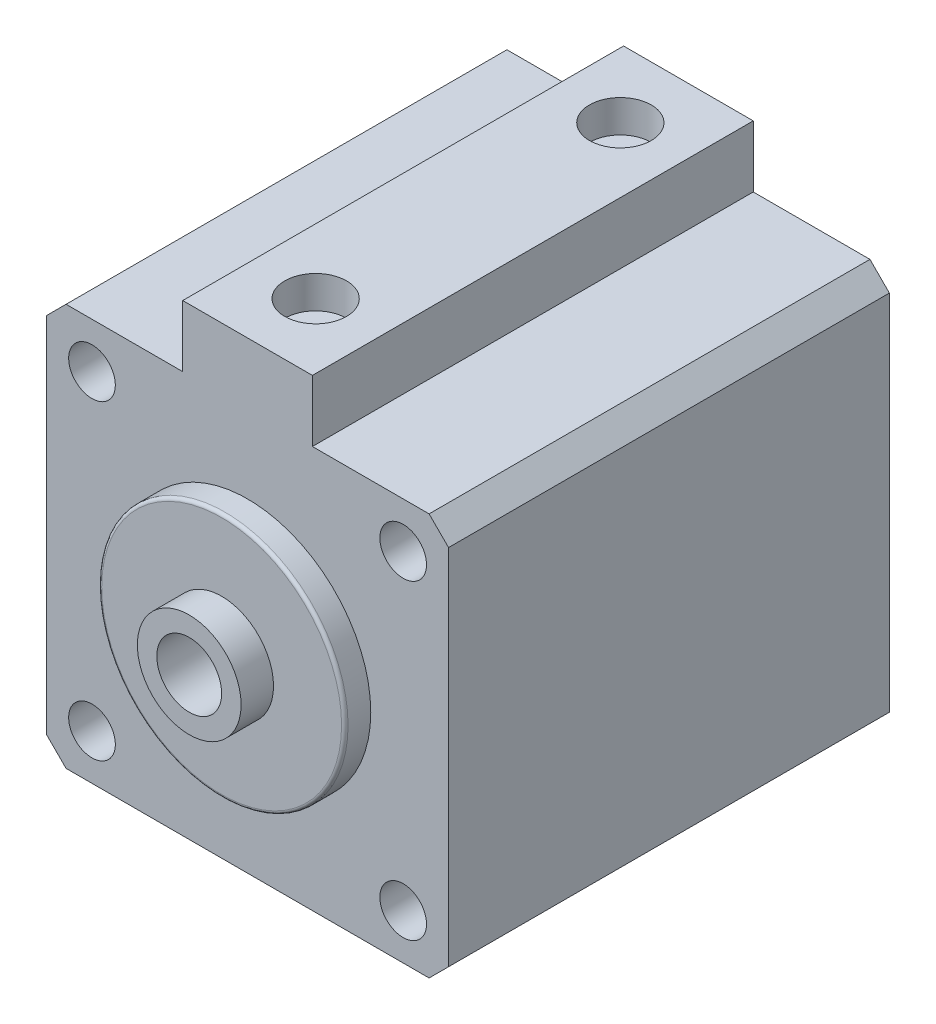
ISO-10303-21;
HEADER;
FILE_DESCRIPTION(('STEP AP214'),'2;1');
FILE_NAME('part.step','',(''),(''),'','','');
FILE_SCHEMA(('AUTOMOTIVE_DESIGN { 1 0 10303 214 1 1 1 1 }'));
ENDSEC;
DATA;
#1=APPLICATION_CONTEXT('core data for automotive mechanical design processes');
#2=APPLICATION_PROTOCOL_DEFINITION('international standard','automotive_design',2000,#1);
#3=PRODUCT_CONTEXT('',#1,'mechanical');
#4=PRODUCT('Part','Part','',(#3));
#5=PRODUCT_RELATED_PRODUCT_CATEGORY('part','',(#4));
#6=PRODUCT_DEFINITION_FORMATION('','',#4);
#7=PRODUCT_DEFINITION_CONTEXT('part definition',#1,'design');
#8=PRODUCT_DEFINITION('design','',#6,#7);
#9=PRODUCT_DEFINITION_SHAPE('','',#8);
#10=(LENGTH_UNIT() NAMED_UNIT(*) SI_UNIT(.MILLI.,.METRE.));
#11=(NAMED_UNIT(*) PLANE_ANGLE_UNIT() SI_UNIT($,.RADIAN.));
#12=(NAMED_UNIT(*) SI_UNIT($,.STERADIAN.) SOLID_ANGLE_UNIT());
#13=UNCERTAINTY_MEASURE_WITH_UNIT(LENGTH_MEASURE(1.E-05),#10,'distance_accuracy_value','');
#14=(GEOMETRIC_REPRESENTATION_CONTEXT(3) GLOBAL_UNCERTAINTY_ASSIGNED_CONTEXT((#13)) GLOBAL_UNIT_ASSIGNED_CONTEXT((#10,
#11,#12)) REPRESENTATION_CONTEXT('',''));
#15=CARTESIAN_POINT('',(0.,0.,0.));
#16=DIRECTION('',(0.,0.,1.));
#17=DIRECTION('',(1.,0.,0.));
#18=AXIS2_PLACEMENT_3D('',#15,#16,#17);
#19=CARTESIAN_POINT('',(0.,62.,68.));
#20=DIRECTION('',(0.,-1.,0.));
#21=DIRECTION('',(0.,0.,-1.));
#22=AXIS2_PLACEMENT_3D('',#19,#20,#21);
#23=PLANE('',#22);
#24=DIRECTION('',(0.,0.,1.));
#25=VECTOR('',#24,1.);
#26=CARTESIAN_POINT('',(21.,62.,0.));
#27=LINE('',#26,#25);
#28=CARTESIAN_POINT('',(21.,62.,0.));
#29=VERTEX_POINT('',#28);
#30=CARTESIAN_POINT('',(21.,62.,68.));
#31=VERTEX_POINT('',#30);
#32=EDGE_CURVE('E127',#29,#31,#27,.T.);
#33=ORIENTED_EDGE('',*,*,#32,.F.);
#34=DIRECTION('',(-1.,0.,0.));
#35=VECTOR('',#34,1.);
#36=CARTESIAN_POINT('',(0.,62.,0.));
#37=LINE('',#36,#35);
#38=CARTESIAN_POINT('',(3.00000000000002,62.,0.));
#39=VERTEX_POINT('',#38);
#40=EDGE_CURVE('E140',#29,#39,#37,.T.);
#41=ORIENTED_EDGE('',*,*,#40,.T.);
#42=DIRECTION('',(0.,0.,1.));
#43=VECTOR('',#42,1.);
#44=CARTESIAN_POINT('',(3.00000000000002,62.,68.));
#45=LINE('',#44,#43);
#46=CARTESIAN_POINT('',(3.00000000000002,62.,68.));
#47=VERTEX_POINT('',#46);
#48=EDGE_CURVE('E164',#39,#47,#45,.T.);
#49=ORIENTED_EDGE('',*,*,#48,.T.);
#50=DIRECTION('',(-1.,0.,0.));
#51=VECTOR('',#50,1.);
#52=CARTESIAN_POINT('',(0.,62.,68.));
#53=LINE('',#52,#51);
#54=EDGE_CURVE('E142',#31,#47,#53,.T.);
#55=ORIENTED_EDGE('',*,*,#54,.F.);
#56=EDGE_LOOP('',(#33,#41,#49,#55));
#57=FACE_BOUND('',#56,.T.);
#58=ADVANCED_FACE('F33',(#57),#23,.F.);
#59=CARTESIAN_POINT('',(0.,0.,68.));
#60=DIRECTION('',(1.,0.,0.));
#61=DIRECTION('',(0.,0.,-1.));
#62=AXIS2_PLACEMENT_3D('',#59,#60,#61);
#63=PLANE('',#62);
#64=DIRECTION('',(0.,-1.,0.));
#65=VECTOR('',#64,1.);
#66=CARTESIAN_POINT('',(0.,0.,0.));
#67=LINE('',#66,#65);
#68=CARTESIAN_POINT('',(0.,59.,0.));
#69=VERTEX_POINT('',#68);
#70=CARTESIAN_POINT('',(0.,3.00000000000002,0.));
#71=VERTEX_POINT('',#70);
#72=EDGE_CURVE('E285',#69,#71,#67,.T.);
#73=ORIENTED_EDGE('',*,*,#72,.T.);
#74=DIRECTION('',(0.,0.,1.));
#75=VECTOR('',#74,1.);
#76=CARTESIAN_POINT('',(0.,3.00000000000002,68.));
#77=LINE('',#76,#75);
#78=CARTESIAN_POINT('',(0.,3.00000000000002,68.));
#79=VERTEX_POINT('',#78);
#80=EDGE_CURVE('E197',#71,#79,#77,.T.);
#81=ORIENTED_EDGE('',*,*,#80,.T.);
#82=DIRECTION('',(0.,-1.,0.));
#83=VECTOR('',#82,1.);
#84=CARTESIAN_POINT('',(0.,0.,68.));
#85=LINE('',#84,#83);
#86=CARTESIAN_POINT('',(0.,59.,68.));
#87=VERTEX_POINT('',#86);
#88=EDGE_CURVE('E155',#87,#79,#85,.T.);
#89=ORIENTED_EDGE('',*,*,#88,.F.);
#90=DIRECTION('',(0.,0.,-1.));
#91=VECTOR('',#90,1.);
#92=CARTESIAN_POINT('',(0.,59.,68.));
#93=LINE('',#92,#91);
#94=EDGE_CURVE('E194',#87,#69,#93,.T.);
#95=ORIENTED_EDGE('',*,*,#94,.T.);
#96=EDGE_LOOP('',(#73,#81,#89,#95));
#97=FACE_BOUND('',#96,.T.);
#98=ADVANCED_FACE('F215',(#97),#63,.F.);
#99=CARTESIAN_POINT('',(0.,0.,68.));
#100=DIRECTION('',(0.,1.,0.));
#101=DIRECTION('',(0.,0.,1.));
#102=AXIS2_PLACEMENT_3D('',#99,#100,#101);
#103=PLANE('',#102);
#104=DIRECTION('',(1.,0.,0.));
#105=VECTOR('',#104,1.);
#106=CARTESIAN_POINT('',(0.,0.,0.));
#107=LINE('',#106,#105);
#108=CARTESIAN_POINT('',(3.,0.,0.));
#109=VERTEX_POINT('',#108);
#110=CARTESIAN_POINT('',(59.,0.,0.));
#111=VERTEX_POINT('',#110);
#112=EDGE_CURVE('E157',#109,#111,#107,.T.);
#113=ORIENTED_EDGE('',*,*,#112,.T.);
#114=DIRECTION('',(0.,0.,1.));
#115=VECTOR('',#114,1.);
#116=CARTESIAN_POINT('',(59.,0.,68.));
#117=LINE('',#116,#115);
#118=CARTESIAN_POINT('',(59.,0.,68.));
#119=VERTEX_POINT('',#118);
#120=EDGE_CURVE('E56',#111,#119,#117,.T.);
#121=ORIENTED_EDGE('',*,*,#120,.T.);
#122=DIRECTION('',(1.,0.,0.));
#123=VECTOR('',#122,1.);
#124=CARTESIAN_POINT('',(0.,0.,68.));
#125=LINE('',#124,#123);
#126=CARTESIAN_POINT('',(3.,0.,68.));
#127=VERTEX_POINT('',#126);
#128=EDGE_CURVE('E290',#127,#119,#125,.T.);
#129=ORIENTED_EDGE('',*,*,#128,.F.);
#130=DIRECTION('',(0.,0.,-1.));
#131=VECTOR('',#130,1.);
#132=CARTESIAN_POINT('',(3.,0.,68.));
#133=LINE('',#132,#131);
#134=EDGE_CURVE('E190',#127,#109,#133,.T.);
#135=ORIENTED_EDGE('',*,*,#134,.T.);
#136=EDGE_LOOP('',(#113,#121,#129,#135));
#137=FACE_BOUND('',#136,.T.);
#138=ADVANCED_FACE('F221',(#137),#103,.F.);
#139=CARTESIAN_POINT('',(62.,0.,68.));
#140=DIRECTION('',(-1.,0.,0.));
#141=DIRECTION('',(0.,0.,1.));
#142=AXIS2_PLACEMENT_3D('',#139,#140,#141);
#143=PLANE('',#142);
#144=DIRECTION('',(0.,1.,0.));
#145=VECTOR('',#144,1.);
#146=CARTESIAN_POINT('',(62.,0.,0.));
#147=LINE('',#146,#145);
#148=CARTESIAN_POINT('',(62.,3.,0.));
#149=VERTEX_POINT('',#148);
#150=CARTESIAN_POINT('',(62.,59.,0.));
#151=VERTEX_POINT('',#150);
#152=EDGE_CURVE('E152',#149,#151,#147,.T.);
#153=ORIENTED_EDGE('',*,*,#152,.T.);
#154=DIRECTION('',(0.,0.,1.));
#155=VECTOR('',#154,1.);
#156=CARTESIAN_POINT('',(62.,59.,68.));
#157=LINE('',#156,#155);
#158=CARTESIAN_POINT('',(62.,59.,68.));
#159=VERTEX_POINT('',#158);
#160=EDGE_CURVE('E180',#151,#159,#157,.T.);
#161=ORIENTED_EDGE('',*,*,#160,.T.);
#162=DIRECTION('',(0.,1.,0.));
#163=VECTOR('',#162,1.);
#164=CARTESIAN_POINT('',(62.,0.,68.));
#165=LINE('',#164,#163);
#166=CARTESIAN_POINT('',(62.,3.,68.));
#167=VERTEX_POINT('',#166);
#168=EDGE_CURVE('E292',#167,#159,#165,.T.);
#169=ORIENTED_EDGE('',*,*,#168,.F.);
#170=DIRECTION('',(0.,0.,-1.));
#171=VECTOR('',#170,1.);
#172=CARTESIAN_POINT('',(62.,3.,68.));
#173=LINE('',#172,#171);
#174=EDGE_CURVE('E177',#167,#149,#173,.T.);
#175=ORIENTED_EDGE('',*,*,#174,.T.);
#176=EDGE_LOOP('',(#153,#161,#169,#175));
#177=FACE_BOUND('',#176,.T.);
#178=ADVANCED_FACE('F228',(#177),#143,.F.);
#179=CARTESIAN_POINT('',(59.,62.,0.));
#180=VERTEX_POINT('',#179);
#181=CARTESIAN_POINT('',(41.,62.,0.));
#182=VERTEX_POINT('',#181);
#183=EDGE_CURVE('E151',#180,#182,#37,.T.);
#184=ORIENTED_EDGE('',*,*,#183,.T.);
#185=DIRECTION('',(0.,0.,1.));
#186=VECTOR('',#185,1.);
#187=CARTESIAN_POINT('',(41.,62.,0.));
#188=LINE('',#187,#186);
#189=CARTESIAN_POINT('',(41.,62.,68.));
#190=VERTEX_POINT('',#189);
#191=EDGE_CURVE('E143',#182,#190,#188,.T.);
#192=ORIENTED_EDGE('',*,*,#191,.T.);
#193=CARTESIAN_POINT('',(59.,62.,68.));
#194=VERTEX_POINT('',#193);
#195=EDGE_CURVE('E165',#194,#190,#53,.T.);
#196=ORIENTED_EDGE('',*,*,#195,.F.);
#197=DIRECTION('',(0.,0.,-1.));
#198=VECTOR('',#197,1.);
#199=CARTESIAN_POINT('',(59.,62.,68.));
#200=LINE('',#199,#198);
#201=EDGE_CURVE('E167',#194,#180,#200,.T.);
#202=ORIENTED_EDGE('',*,*,#201,.T.);
#203=EDGE_LOOP('',(#184,#192,#196,#202));
#204=FACE_BOUND('',#203,.T.);
#205=ADVANCED_FACE('F217',(#204),#23,.F.);
#206=CARTESIAN_POINT('',(0.,0.,68.));
#207=DIRECTION('',(0.,0.,-1.));
#208=DIRECTION('',(-1.,0.,0.));
#209=AXIS2_PLACEMENT_3D('',#206,#207,#208);
#210=PLANE('',#209);
#211=CARTESIAN_POINT('',(55.,55.,68.));
#212=DIRECTION('',(0.,0.,-1.));
#213=DIRECTION('',(-1.,0.,0.));
#214=AXIS2_PLACEMENT_3D('',#211,#212,#213);
#215=CIRCLE('',#214,3.6);
#216=CARTESIAN_POINT('',(51.4,55.,68.));
#217=VERTEX_POINT('',#216);
#218=EDGE_CURVE('E272',#217,#217,#215,.T.);
#219=ORIENTED_EDGE('',*,*,#218,.T.);
#220=EDGE_LOOP('',(#219));
#221=FACE_BOUND('',#220,.T.);
#222=CARTESIAN_POINT('',(55.,7.00000000000001,68.));
#223=DIRECTION('',(0.,0.,-1.));
#224=DIRECTION('',(-1.,0.,0.));
#225=AXIS2_PLACEMENT_3D('',#222,#223,#224);
#226=CIRCLE('',#225,3.6);
#227=CARTESIAN_POINT('',(51.4,7.00000000000001,68.));
#228=VERTEX_POINT('',#227);
#229=EDGE_CURVE('E269',#228,#228,#226,.T.);
#230=ORIENTED_EDGE('',*,*,#229,.T.);
#231=EDGE_LOOP('',(#230));
#232=FACE_BOUND('',#231,.T.);
#233=CARTESIAN_POINT('',(7.00000000000001,6.99999999999999,68.));
#234=DIRECTION('',(0.,0.,-1.));
#235=DIRECTION('',(-1.,0.,0.));
#236=AXIS2_PLACEMENT_3D('',#233,#234,#235);
#237=CIRCLE('',#236,3.6);
#238=CARTESIAN_POINT('',(3.40000000000002,6.99999999999999,68.));
#239=VERTEX_POINT('',#238);
#240=EDGE_CURVE('E261',#239,#239,#237,.T.);
#241=ORIENTED_EDGE('',*,*,#240,.T.);
#242=EDGE_LOOP('',(#241));
#243=FACE_BOUND('',#242,.T.);
#244=CARTESIAN_POINT('',(7.,55.,68.));
#245=DIRECTION('',(0.,0.,-1.));
#246=DIRECTION('',(-1.,0.,0.));
#247=AXIS2_PLACEMENT_3D('',#244,#245,#246);
#248=CIRCLE('',#247,3.6);
#249=CARTESIAN_POINT('',(3.4,55.,68.));
#250=VERTEX_POINT('',#249);
#251=EDGE_CURVE('E278',#250,#250,#248,.T.);
#252=ORIENTED_EDGE('',*,*,#251,.T.);
#253=EDGE_LOOP('',(#252));
#254=FACE_BOUND('',#253,.T.);
#255=CARTESIAN_POINT('',(31.,31.,68.));
#256=DIRECTION('',(0.,0.,-1.));
#257=DIRECTION('',(-1.,0.,0.));
#258=AXIS2_PLACEMENT_3D('',#255,#256,#257);
#259=CIRCLE('',#258,19.);
#260=CARTESIAN_POINT('',(12.,31.,68.));
#261=VERTEX_POINT('',#260);
#262=EDGE_CURVE('E161',#261,#261,#259,.F.);
#263=ORIENTED_EDGE('',*,*,#262,.F.);
#264=EDGE_LOOP('',(#263));
#265=FACE_BOUND('',#264,.T.);
#266=ORIENTED_EDGE('',*,*,#168,.T.);
#267=DIRECTION('',(0.707106781186546,-0.707106781186549,0.));
#268=VECTOR('',#267,1.);
#269=CARTESIAN_POINT('',(59.,62.,68.));
#270=LINE('',#269,#268);
#271=EDGE_CURVE('E188',#159,#194,#270,.F.);
#272=ORIENTED_EDGE('',*,*,#271,.T.);
#273=ORIENTED_EDGE('',*,*,#195,.T.);
#274=DIRECTION('',(0.,1.,0.));
#275=VECTOR('',#274,1.);
#276=CARTESIAN_POINT('',(41.,62.,68.));
#277=LINE('',#276,#275);
#278=CARTESIAN_POINT('',(41.,71.5,68.));
#279=VERTEX_POINT('',#278);
#280=EDGE_CURVE('E48',#190,#279,#277,.T.);
#281=ORIENTED_EDGE('',*,*,#280,.T.);
#282=DIRECTION('',(-1.,0.,0.));
#283=VECTOR('',#282,1.);
#284=CARTESIAN_POINT('',(21.,71.5,68.));
#285=LINE('',#284,#283);
#286=CARTESIAN_POINT('',(21.,71.5,68.));
#287=VERTEX_POINT('',#286);
#288=EDGE_CURVE('E135',#279,#287,#285,.T.);
#289=ORIENTED_EDGE('',*,*,#288,.T.);
#290=DIRECTION('',(0.,-1.,0.));
#291=VECTOR('',#290,1.);
#292=CARTESIAN_POINT('',(21.,62.,68.));
#293=LINE('',#292,#291);
#294=EDGE_CURVE('E247',#287,#31,#293,.T.);
#295=ORIENTED_EDGE('',*,*,#294,.T.);
#296=ORIENTED_EDGE('',*,*,#54,.T.);
#297=DIRECTION('',(0.707106781186549,0.707106781186546,0.));
#298=VECTOR('',#297,1.);
#299=CARTESIAN_POINT('',(0.,59.,68.));
#300=LINE('',#299,#298);
#301=EDGE_CURVE('E182',#47,#87,#300,.F.);
#302=ORIENTED_EDGE('',*,*,#301,.T.);
#303=ORIENTED_EDGE('',*,*,#88,.T.);
#304=DIRECTION('',(-0.707106781186546,0.707106781186549,0.));
#305=VECTOR('',#304,1.);
#306=CARTESIAN_POINT('',(3.,0.,68.));
#307=LINE('',#306,#305);
#308=EDGE_CURVE('E184',#79,#127,#307,.F.);
#309=ORIENTED_EDGE('',*,*,#308,.T.);
#310=ORIENTED_EDGE('',*,*,#128,.T.);
#311=DIRECTION('',(-0.707106781186549,-0.707106781186546,0.));
#312=VECTOR('',#311,1.);
#313=CARTESIAN_POINT('',(62.,3.,68.));
#314=LINE('',#313,#312);
#315=EDGE_CURVE('E186',#119,#167,#314,.F.);
#316=ORIENTED_EDGE('',*,*,#315,.T.);
#317=EDGE_LOOP('',(#266,#272,#273,#281,#289,#295,#296,#302,#303,#309,#310,#316));
#318=FACE_BOUND('',#317,.T.);
#319=ADVANCED_FACE('F227',(#221,#232,#243,#254,#265,#318),#210,.F.);
#320=CARTESIAN_POINT('',(0.,0.,0.));
#321=DIRECTION('',(0.,0.,-1.));
#322=DIRECTION('',(-1.,0.,0.));
#323=AXIS2_PLACEMENT_3D('',#320,#321,#322);
#324=PLANE('',#323);
#325=CARTESIAN_POINT('',(55.,55.,0.));
#326=DIRECTION('',(0.,0.,1.));
#327=DIRECTION('',(-1.,0.,0.));
#328=AXIS2_PLACEMENT_3D('',#325,#326,#327);
#329=CIRCLE('',#328,3.6);
#330=CARTESIAN_POINT('',(51.4,55.,0.));
#331=VERTEX_POINT('',#330);
#332=EDGE_CURVE('E258',#331,#331,#329,.T.);
#333=ORIENTED_EDGE('',*,*,#332,.T.);
#334=EDGE_LOOP('',(#333));
#335=FACE_BOUND('',#334,.T.);
#336=CARTESIAN_POINT('',(55.,7.00000000000001,0.));
#337=DIRECTION('',(0.,0.,1.));
#338=DIRECTION('',(1.,0.,0.));
#339=AXIS2_PLACEMENT_3D('',#336,#337,#338);
#340=CIRCLE('',#339,3.6);
#341=CARTESIAN_POINT('',(58.6,7.00000000000001,0.));
#342=VERTEX_POINT('',#341);
#343=EDGE_CURVE('E262',#342,#342,#340,.T.);
#344=ORIENTED_EDGE('',*,*,#343,.T.);
#345=EDGE_LOOP('',(#344));
#346=FACE_BOUND('',#345,.T.);
#347=CARTESIAN_POINT('',(7.00000000000001,6.99999999999999,0.));
#348=DIRECTION('',(0.,0.,1.));
#349=DIRECTION('',(-1.,0.,0.));
#350=AXIS2_PLACEMENT_3D('',#347,#348,#349);
#351=CIRCLE('',#350,3.6);
#352=CARTESIAN_POINT('',(3.40000000000002,6.99999999999999,0.));
#353=VERTEX_POINT('',#352);
#354=EDGE_CURVE('E254',#353,#353,#351,.T.);
#355=ORIENTED_EDGE('',*,*,#354,.T.);
#356=EDGE_LOOP('',(#355));
#357=FACE_BOUND('',#356,.T.);
#358=CARTESIAN_POINT('',(7.,55.,0.));
#359=DIRECTION('',(0.,0.,1.));
#360=DIRECTION('',(1.,0.,0.));
#361=AXIS2_PLACEMENT_3D('',#358,#359,#360);
#362=CIRCLE('',#361,3.6);
#363=CARTESIAN_POINT('',(10.6,55.,0.));
#364=VERTEX_POINT('',#363);
#365=EDGE_CURVE('E275',#364,#364,#362,.T.);
#366=ORIENTED_EDGE('',*,*,#365,.T.);
#367=EDGE_LOOP('',(#366));
#368=FACE_BOUND('',#367,.T.);
#369=ORIENTED_EDGE('',*,*,#183,.F.);
#370=DIRECTION('',(-0.707106781186546,0.707106781186549,0.));
#371=VECTOR('',#370,1.);
#372=CARTESIAN_POINT('',(60.5000000000001,60.4999999999999,0.));
#373=LINE('',#372,#371);
#374=EDGE_CURVE('E175',#180,#151,#373,.F.);
#375=ORIENTED_EDGE('',*,*,#374,.T.);
#376=ORIENTED_EDGE('',*,*,#152,.F.);
#377=DIRECTION('',(0.707106781186549,0.707106781186546,0.));
#378=VECTOR('',#377,1.);
#379=CARTESIAN_POINT('',(29.4999999999999,-29.5,0.));
#380=LINE('',#379,#378);
#381=EDGE_CURVE('E173',#149,#111,#380,.F.);
#382=ORIENTED_EDGE('',*,*,#381,.T.);
#383=ORIENTED_EDGE('',*,*,#112,.F.);
#384=DIRECTION('',(0.707106781186546,-0.707106781186549,0.));
#385=VECTOR('',#384,1.);
#386=CARTESIAN_POINT('',(1.50000000000001,1.5,0.));
#387=LINE('',#386,#385);
#388=EDGE_CURVE('E171',#109,#71,#387,.F.);
#389=ORIENTED_EDGE('',*,*,#388,.T.);
#390=ORIENTED_EDGE('',*,*,#72,.F.);
#391=DIRECTION('',(-0.707106781186549,-0.707106781186546,0.));
#392=VECTOR('',#391,1.);
#393=CARTESIAN_POINT('',(-29.5,29.5000000000001,0.));
#394=LINE('',#393,#392);
#395=EDGE_CURVE('E149',#69,#39,#394,.F.);
#396=ORIENTED_EDGE('',*,*,#395,.T.);
#397=ORIENTED_EDGE('',*,*,#40,.F.);
#398=DIRECTION('',(0.,-1.,0.));
#399=VECTOR('',#398,1.);
#400=CARTESIAN_POINT('',(21.,62.,0.));
#401=LINE('',#400,#399);
#402=CARTESIAN_POINT('',(21.,71.5,0.));
#403=VERTEX_POINT('',#402);
#404=EDGE_CURVE('E123',#403,#29,#401,.T.);
#405=ORIENTED_EDGE('',*,*,#404,.F.);
#406=DIRECTION('',(-1.,0.,0.));
#407=VECTOR('',#406,1.);
#408=CARTESIAN_POINT('',(21.,71.5,0.));
#409=LINE('',#408,#407);
#410=CARTESIAN_POINT('',(41.,71.5,0.));
#411=VERTEX_POINT('',#410);
#412=EDGE_CURVE('E144',#411,#403,#409,.T.);
#413=ORIENTED_EDGE('',*,*,#412,.F.);
#414=DIRECTION('',(0.,1.,0.));
#415=VECTOR('',#414,1.);
#416=CARTESIAN_POINT('',(41.,62.,0.));
#417=LINE('',#416,#415);
#418=EDGE_CURVE('E134',#182,#411,#417,.T.);
#419=ORIENTED_EDGE('',*,*,#418,.F.);
#420=EDGE_LOOP('',(#369,#375,#376,#382,#383,#389,#390,#396,#397,#405,#413,#419));
#421=FACE_BOUND('',#420,.T.);
#422=ADVANCED_FACE('F147',(#335,#346,#357,#368,#421),#324,.T.);
#423=CARTESIAN_POINT('',(31.,31.,72.));
#424=DIRECTION('',(0.,0.,-1.));
#425=DIRECTION('',(-1.,0.,0.));
#426=AXIS2_PLACEMENT_3D('',#423,#424,#425);
#427=CYLINDRICAL_SURFACE('',#426,19.);
#428=CARTESIAN_POINT('',(31.,31.,71.5));
#429=DIRECTION('',(0.,0.,1.));
#430=DIRECTION('',(1.,0.,0.));
#431=AXIS2_PLACEMENT_3D('',#428,#429,#430);
#432=CIRCLE('',#431,19.);
#433=CARTESIAN_POINT('',(50.,31.,71.5));
#434=VERTEX_POINT('',#433);
#435=EDGE_CURVE('E11',#434,#434,#432,.F.);
#436=ORIENTED_EDGE('',*,*,#435,.T.);
#437=EDGE_LOOP('',(#436));
#438=FACE_BOUND('',#437,.T.);
#439=ORIENTED_EDGE('',*,*,#262,.T.);
#440=EDGE_LOOP('',(#439));
#441=FACE_BOUND('',#440,.T.);
#442=ADVANCED_FACE('F390',(#438,#441),#427,.T.);
#443=CARTESIAN_POINT('',(31.,31.,72.));
#444=DIRECTION('',(0.,0.,1.));
#445=DIRECTION('',(1.,0.,0.));
#446=AXIS2_PLACEMENT_3D('',#443,#444,#445);
#447=PLANE('',#446);
#448=CARTESIAN_POINT('',(31.,31.,72.));
#449=DIRECTION('',(0.,0.,1.));
#450=DIRECTION('',(1.,0.,0.));
#451=AXIS2_PLACEMENT_3D('',#448,#449,#450);
#452=CIRCLE('',#451,18.5);
#453=CARTESIAN_POINT('',(49.5,31.,72.));
#454=VERTEX_POINT('',#453);
#455=EDGE_CURVE('E41',#454,#454,#452,.T.);
#456=ORIENTED_EDGE('',*,*,#455,.T.);
#457=EDGE_LOOP('',(#456));
#458=FACE_BOUND('',#457,.T.);
#459=CARTESIAN_POINT('',(31.,31.,72.));
#460=DIRECTION('',(0.,0.,1.));
#461=DIRECTION('',(1.,0.,0.));
#462=AXIS2_PLACEMENT_3D('',#459,#460,#461);
#463=CIRCLE('',#462,8.);
#464=CARTESIAN_POINT('',(39.,31.,72.));
#465=VERTEX_POINT('',#464);
#466=EDGE_CURVE('E281',#465,#465,#463,.T.);
#467=ORIENTED_EDGE('',*,*,#466,.F.);
#468=EDGE_LOOP('',(#467));
#469=FACE_BOUND('',#468,.T.);
#470=ADVANCED_FACE('F201',(#458,#469),#447,.T.);
#471=CARTESIAN_POINT('',(31.,31.,77.));
#472=DIRECTION('',(0.,0.,-1.));
#473=DIRECTION('',(-1.,0.,0.));
#474=AXIS2_PLACEMENT_3D('',#471,#472,#473);
#475=CYLINDRICAL_SURFACE('',#474,8.);
#476=CARTESIAN_POINT('',(31.,31.,77.));
#477=DIRECTION('',(0.,0.,1.));
#478=DIRECTION('',(1.,0.,0.));
#479=AXIS2_PLACEMENT_3D('',#476,#477,#478);
#480=CIRCLE('',#479,8.);
#481=CARTESIAN_POINT('',(39.,31.,77.));
#482=VERTEX_POINT('',#481);
#483=EDGE_CURVE('E282',#482,#482,#480,.T.);
#484=ORIENTED_EDGE('',*,*,#483,.F.);
#485=EDGE_LOOP('',(#484));
#486=FACE_BOUND('',#485,.T.);
#487=ORIENTED_EDGE('',*,*,#466,.T.);
#488=EDGE_LOOP('',(#487));
#489=FACE_BOUND('',#488,.T.);
#490=ADVANCED_FACE('F469',(#486,#489),#475,.T.);
#491=CARTESIAN_POINT('',(31.,31.,77.));
#492=DIRECTION('',(0.,0.,1.));
#493=DIRECTION('',(1.,0.,0.));
#494=AXIS2_PLACEMENT_3D('',#491,#492,#493);
#495=PLANE('',#494);
#496=CARTESIAN_POINT('',(31.,31.,77.));
#497=DIRECTION('',(0.,0.,1.));
#498=DIRECTION('',(1.,0.,0.));
#499=AXIS2_PLACEMENT_3D('',#496,#497,#498);
#500=CIRCLE('',#499,5.);
#501=CARTESIAN_POINT('',(36.,31.,77.));
#502=VERTEX_POINT('',#501);
#503=EDGE_CURVE('E594',#502,#502,#500,.T.);
#504=ORIENTED_EDGE('',*,*,#503,.F.);
#505=EDGE_LOOP('',(#504));
#506=FACE_BOUND('',#505,.T.);
#507=ORIENTED_EDGE('',*,*,#483,.T.);
#508=EDGE_LOOP('',(#507));
#509=FACE_BOUND('',#508,.T.);
#510=ADVANCED_FACE('F464',(#506,#509),#495,.T.);
#511=CARTESIAN_POINT('',(7.,55.,0.));
#512=DIRECTION('',(0.,0.,1.));
#513=DIRECTION('',(1.,0.,0.));
#514=AXIS2_PLACEMENT_3D('',#511,#512,#513);
#515=CYLINDRICAL_SURFACE('',#514,3.6);
#516=ORIENTED_EDGE('',*,*,#365,.F.);
#517=EDGE_LOOP('',(#516));
#518=FACE_BOUND('',#517,.T.);
#519=ORIENTED_EDGE('',*,*,#251,.F.);
#520=EDGE_LOOP('',(#519));
#521=FACE_BOUND('',#520,.T.);
#522=ADVANCED_FACE('F468',(#518,#521),#515,.F.);
#523=CARTESIAN_POINT('',(7.00000000000001,6.99999999999999,0.));
#524=DIRECTION('',(0.,0.,1.));
#525=DIRECTION('',(1.,0.,0.));
#526=AXIS2_PLACEMENT_3D('',#523,#524,#525);
#527=CYLINDRICAL_SURFACE('',#526,3.6);
#528=ORIENTED_EDGE('',*,*,#354,.F.);
#529=EDGE_LOOP('',(#528));
#530=FACE_BOUND('',#529,.T.);
#531=ORIENTED_EDGE('',*,*,#240,.F.);
#532=EDGE_LOOP('',(#531));
#533=FACE_BOUND('',#532,.T.);
#534=ADVANCED_FACE('F518',(#530,#533),#527,.F.);
#535=CARTESIAN_POINT('',(55.,7.00000000000001,0.));
#536=DIRECTION('',(0.,0.,1.));
#537=DIRECTION('',(1.,0.,0.));
#538=AXIS2_PLACEMENT_3D('',#535,#536,#537);
#539=CYLINDRICAL_SURFACE('',#538,3.6);
#540=ORIENTED_EDGE('',*,*,#343,.F.);
#541=EDGE_LOOP('',(#540));
#542=FACE_BOUND('',#541,.T.);
#543=ORIENTED_EDGE('',*,*,#229,.F.);
#544=EDGE_LOOP('',(#543));
#545=FACE_BOUND('',#544,.T.);
#546=ADVANCED_FACE('F528',(#542,#545),#539,.F.);
#547=CARTESIAN_POINT('',(55.,55.,0.));
#548=DIRECTION('',(0.,0.,1.));
#549=DIRECTION('',(1.,0.,0.));
#550=AXIS2_PLACEMENT_3D('',#547,#548,#549);
#551=CYLINDRICAL_SURFACE('',#550,3.6);
#552=ORIENTED_EDGE('',*,*,#332,.F.);
#553=EDGE_LOOP('',(#552));
#554=FACE_BOUND('',#553,.T.);
#555=ORIENTED_EDGE('',*,*,#218,.F.);
#556=EDGE_LOOP('',(#555));
#557=FACE_BOUND('',#556,.T.);
#558=ADVANCED_FACE('F330',(#554,#557),#551,.F.);
#559=CARTESIAN_POINT('',(59.,62.,68.));
#560=DIRECTION('',(-0.707106781186549,-0.707106781186546,0.));
#561=DIRECTION('',(0.,0.,-1.));
#562=AXIS2_PLACEMENT_3D('',#559,#560,#561);
#563=PLANE('',#562);
#564=ORIENTED_EDGE('',*,*,#271,.F.);
#565=ORIENTED_EDGE('',*,*,#160,.F.);
#566=ORIENTED_EDGE('',*,*,#374,.F.);
#567=ORIENTED_EDGE('',*,*,#201,.F.);
#568=EDGE_LOOP('',(#564,#565,#566,#567));
#569=FACE_BOUND('',#568,.T.);
#570=ADVANCED_FACE('F308',(#569),#563,.F.);
#571=CARTESIAN_POINT('',(62.,3.,68.));
#572=DIRECTION('',(-0.707106781186546,0.707106781186549,0.));
#573=DIRECTION('',(0.,0.,-1.));
#574=AXIS2_PLACEMENT_3D('',#571,#572,#573);
#575=PLANE('',#574);
#576=ORIENTED_EDGE('',*,*,#315,.F.);
#577=ORIENTED_EDGE('',*,*,#120,.F.);
#578=ORIENTED_EDGE('',*,*,#381,.F.);
#579=ORIENTED_EDGE('',*,*,#174,.F.);
#580=EDGE_LOOP('',(#576,#577,#578,#579));
#581=FACE_BOUND('',#580,.T.);
#582=ADVANCED_FACE('F301',(#581),#575,.F.);
#583=CARTESIAN_POINT('',(3.,0.,68.));
#584=DIRECTION('',(0.707106781186549,0.707106781186546,0.));
#585=DIRECTION('',(0.,0.,-1.));
#586=AXIS2_PLACEMENT_3D('',#583,#584,#585);
#587=PLANE('',#586);
#588=ORIENTED_EDGE('',*,*,#308,.F.);
#589=ORIENTED_EDGE('',*,*,#80,.F.);
#590=ORIENTED_EDGE('',*,*,#388,.F.);
#591=ORIENTED_EDGE('',*,*,#134,.F.);
#592=EDGE_LOOP('',(#588,#589,#590,#591));
#593=FACE_BOUND('',#592,.T.);
#594=ADVANCED_FACE('F320',(#593),#587,.F.);
#595=CARTESIAN_POINT('',(0.,59.,68.));
#596=DIRECTION('',(0.707106781186546,-0.707106781186549,0.));
#597=DIRECTION('',(0.,0.,-1.));
#598=AXIS2_PLACEMENT_3D('',#595,#596,#597);
#599=PLANE('',#598);
#600=ORIENTED_EDGE('',*,*,#301,.F.);
#601=ORIENTED_EDGE('',*,*,#48,.F.);
#602=ORIENTED_EDGE('',*,*,#395,.F.);
#603=ORIENTED_EDGE('',*,*,#94,.F.);
#604=EDGE_LOOP('',(#600,#601,#602,#603));
#605=FACE_BOUND('',#604,.T.);
#606=ADVANCED_FACE('F316',(#605),#599,.F.);
#607=CARTESIAN_POINT('',(21.,62.,0.));
#608=DIRECTION('',(-1.,0.,0.));
#609=DIRECTION('',(0.,0.,1.));
#610=AXIS2_PLACEMENT_3D('',#607,#608,#609);
#611=PLANE('',#610);
#612=ORIENTED_EDGE('',*,*,#294,.F.);
#613=DIRECTION('',(0.,0.,1.));
#614=VECTOR('',#613,1.);
#615=CARTESIAN_POINT('',(21.,71.5,0.));
#616=LINE('',#615,#614);
#617=EDGE_CURVE('E129',#403,#287,#616,.T.);
#618=ORIENTED_EDGE('',*,*,#617,.F.);
#619=ORIENTED_EDGE('',*,*,#404,.T.);
#620=ORIENTED_EDGE('',*,*,#32,.T.);
#621=EDGE_LOOP('',(#612,#618,#619,#620));
#622=FACE_BOUND('',#621,.T.);
#623=ADVANCED_FACE('F126',(#622),#611,.T.);
#624=CARTESIAN_POINT('',(21.,71.5,0.));
#625=DIRECTION('',(0.,1.,0.));
#626=DIRECTION('',(0.,0.,1.));
#627=AXIS2_PLACEMENT_3D('',#624,#625,#626);
#628=PLANE('',#627);
#629=CARTESIAN_POINT('',(31.,71.5,10.5));
#630=DIRECTION('',(0.,1.,0.));
#631=DIRECTION('',(0.,0.,-1.));
#632=AXIS2_PLACEMENT_3D('',#629,#630,#631);
#633=CIRCLE('',#632,4.7625);
#634=CARTESIAN_POINT('',(31.,71.5,5.7375));
#635=VERTEX_POINT('',#634);
#636=EDGE_CURVE('E596',#635,#635,#633,.T.);
#637=ORIENTED_EDGE('',*,*,#636,.F.);
#638=EDGE_LOOP('',(#637));
#639=FACE_BOUND('',#638,.T.);
#640=CARTESIAN_POINT('',(31.,71.5,57.5));
#641=DIRECTION('',(0.,1.,0.));
#642=DIRECTION('',(0.,0.,1.));
#643=AXIS2_PLACEMENT_3D('',#640,#641,#642);
#644=CIRCLE('',#643,4.7625);
#645=CARTESIAN_POINT('',(31.,71.5,62.2625));
#646=VERTEX_POINT('',#645);
#647=EDGE_CURVE('E602',#646,#646,#644,.T.);
#648=ORIENTED_EDGE('',*,*,#647,.F.);
#649=EDGE_LOOP('',(#648));
#650=FACE_BOUND('',#649,.T.);
#651=ORIENTED_EDGE('',*,*,#288,.F.);
#652=DIRECTION('',(0.,0.,1.));
#653=VECTOR('',#652,1.);
#654=CARTESIAN_POINT('',(41.,71.5,0.));
#655=LINE('',#654,#653);
#656=EDGE_CURVE('E255',#411,#279,#655,.T.);
#657=ORIENTED_EDGE('',*,*,#656,.F.);
#658=ORIENTED_EDGE('',*,*,#412,.T.);
#659=ORIENTED_EDGE('',*,*,#617,.T.);
#660=EDGE_LOOP('',(#651,#657,#658,#659));
#661=FACE_BOUND('',#660,.T.);
#662=ADVANCED_FACE('F311',(#639,#650,#661),#628,.T.);
#663=CARTESIAN_POINT('',(41.,62.,0.));
#664=DIRECTION('',(1.,0.,0.));
#665=DIRECTION('',(0.,0.,-1.));
#666=AXIS2_PLACEMENT_3D('',#663,#664,#665);
#667=PLANE('',#666);
#668=ORIENTED_EDGE('',*,*,#280,.F.);
#669=ORIENTED_EDGE('',*,*,#191,.F.);
#670=ORIENTED_EDGE('',*,*,#418,.T.);
#671=ORIENTED_EDGE('',*,*,#656,.T.);
#672=EDGE_LOOP('',(#668,#669,#670,#671));
#673=FACE_BOUND('',#672,.T.);
#674=ADVANCED_FACE('F406',(#673),#667,.T.);
#675=CARTESIAN_POINT('',(31.,66.5,57.5));
#676=DIRECTION('',(0.,1.,0.));
#677=DIRECTION('',(0.,0.,1.));
#678=AXIS2_PLACEMENT_3D('',#675,#676,#677);
#679=CYLINDRICAL_SURFACE('',#678,4.7625);
#680=CARTESIAN_POINT('',(31.,66.5,57.5));
#681=DIRECTION('',(0.,1.,0.));
#682=DIRECTION('',(0.,0.,1.));
#683=AXIS2_PLACEMENT_3D('',#680,#681,#682);
#684=CIRCLE('',#683,4.7625);
#685=CARTESIAN_POINT('',(31.,66.5,62.2625));
#686=VERTEX_POINT('',#685);
#687=EDGE_CURVE('E249',#686,#686,#684,.T.);
#688=ORIENTED_EDGE('',*,*,#687,.F.);
#689=EDGE_LOOP('',(#688));
#690=FACE_BOUND('',#689,.T.);
#691=ORIENTED_EDGE('',*,*,#647,.T.);
#692=EDGE_LOOP('',(#691));
#693=FACE_BOUND('',#692,.T.);
#694=ADVANCED_FACE('F411',(#690,#693),#679,.F.);
#695=CARTESIAN_POINT('',(31.,66.5,57.5));
#696=DIRECTION('',(0.,1.,0.));
#697=DIRECTION('',(0.,0.,1.));
#698=AXIS2_PLACEMENT_3D('',#695,#696,#697);
#699=PLANE('',#698);
#700=ORIENTED_EDGE('',*,*,#687,.T.);
#701=EDGE_LOOP('',(#700));
#702=FACE_BOUND('',#701,.T.);
#703=ADVANCED_FACE('F427',(#702),#699,.T.);
#704=CARTESIAN_POINT('',(31.,66.5,10.5));
#705=DIRECTION('',(0.,1.,0.));
#706=DIRECTION('',(0.,0.,1.));
#707=AXIS2_PLACEMENT_3D('',#704,#705,#706);
#708=CYLINDRICAL_SURFACE('',#707,4.7625);
#709=CARTESIAN_POINT('',(31.,66.5,10.5));
#710=DIRECTION('',(0.,1.,0.));
#711=DIRECTION('',(0.,0.,-1.));
#712=AXIS2_PLACEMENT_3D('',#709,#710,#711);
#713=CIRCLE('',#712,4.7625);
#714=CARTESIAN_POINT('',(31.,66.5,5.7375));
#715=VERTEX_POINT('',#714);
#716=EDGE_CURVE('E599',#715,#715,#713,.T.);
#717=ORIENTED_EDGE('',*,*,#716,.F.);
#718=EDGE_LOOP('',(#717));
#719=FACE_BOUND('',#718,.T.);
#720=ORIENTED_EDGE('',*,*,#636,.T.);
#721=EDGE_LOOP('',(#720));
#722=FACE_BOUND('',#721,.T.);
#723=ADVANCED_FACE('F437',(#719,#722),#708,.F.);
#724=CARTESIAN_POINT('',(31.,66.5,10.5));
#725=DIRECTION('',(0.,-1.,0.));
#726=DIRECTION('',(0.,0.,-1.));
#727=AXIS2_PLACEMENT_3D('',#724,#725,#726);
#728=PLANE('',#727);
#729=ORIENTED_EDGE('',*,*,#716,.T.);
#730=EDGE_LOOP('',(#729));
#731=FACE_BOUND('',#730,.T.);
#732=ADVANCED_FACE('F447',(#731),#728,.F.);
#733=CARTESIAN_POINT('',(31.,31.,7.00000000000001));
#734=DIRECTION('',(0.,0.,1.));
#735=DIRECTION('',(1.,0.,0.));
#736=AXIS2_PLACEMENT_3D('',#733,#734,#735);
#737=CYLINDRICAL_SURFACE('',#736,5.);
#738=CARTESIAN_POINT('',(31.,31.,7.00000000000001));
#739=DIRECTION('',(0.,0.,1.));
#740=DIRECTION('',(1.,0.,0.));
#741=AXIS2_PLACEMENT_3D('',#738,#739,#740);
#742=CIRCLE('',#741,5.);
#743=CARTESIAN_POINT('',(36.,31.,7.00000000000001));
#744=VERTEX_POINT('',#743);
#745=EDGE_CURVE('E591',#744,#744,#742,.T.);
#746=ORIENTED_EDGE('',*,*,#745,.F.);
#747=EDGE_LOOP('',(#746));
#748=FACE_BOUND('',#747,.T.);
#749=ORIENTED_EDGE('',*,*,#503,.T.);
#750=EDGE_LOOP('',(#749));
#751=FACE_BOUND('',#750,.T.);
#752=ADVANCED_FACE('F210',(#748,#751),#737,.F.);
#753=CARTESIAN_POINT('',(31.,31.,7.00000000000001));
#754=DIRECTION('',(0.,0.,1.));
#755=DIRECTION('',(1.,0.,0.));
#756=AXIS2_PLACEMENT_3D('',#753,#754,#755);
#757=PLANE('',#756);
#758=ORIENTED_EDGE('',*,*,#745,.T.);
#759=EDGE_LOOP('',(#758));
#760=FACE_BOUND('',#759,.T.);
#761=ADVANCED_FACE('F205',(#760),#757,.T.);
#762=CARTESIAN_POINT('',(31.,31.,71.5));
#763=DIRECTION('',(0.,0.,1.));
#764=DIRECTION('',(1.,0.,0.));
#765=AXIS2_PLACEMENT_3D('',#762,#763,#764);
#766=TOROIDAL_SURFACE('',#765,18.5,0.5);
#767=ORIENTED_EDGE('',*,*,#435,.F.);
#768=EDGE_LOOP('',(#767));
#769=FACE_BOUND('',#768,.T.);
#770=ORIENTED_EDGE('',*,*,#455,.F.);
#771=EDGE_LOOP('',(#770));
#772=FACE_BOUND('',#771,.T.);
#773=ADVANCED_FACE('F35',(#769,#772),#766,.T.);
#774=CLOSED_SHELL('',(#58,#98,#138,#178,#205,#319,#422,#442,#470,#490,#510,#522,#534,#546,#558,
#570,#582,#594,#606,#623,#662,#674,#694,#703,#723,#732,#752,#761,#773));
#775=MANIFOLD_SOLID_BREP('B2',#774);
#776=ADVANCED_BREP_SHAPE_REPRESENTATION('',(#18,#775),#14);
#777=SHAPE_DEFINITION_REPRESENTATION(#9,#776);
ENDSEC;
END-ISO-10303-21;
